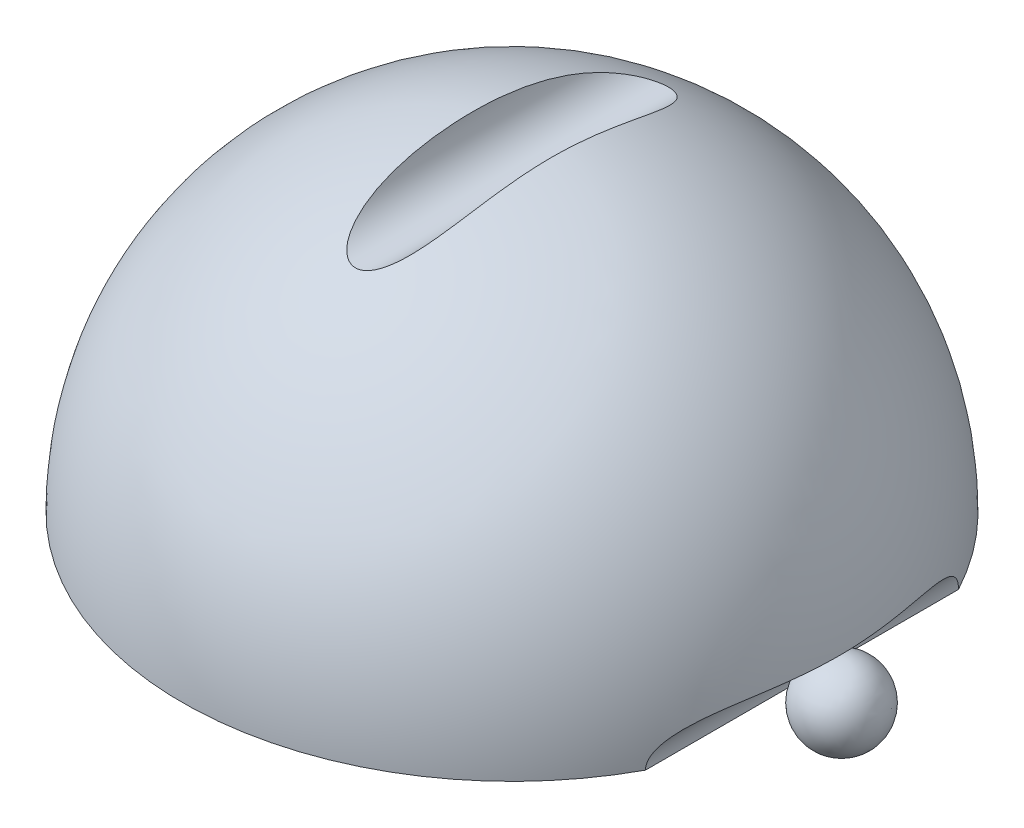
ISO-10303-21;
HEADER;
FILE_DESCRIPTION(('STEP AP214'),'2;1');
FILE_NAME('part.step','',(''),(''),'','','');
FILE_SCHEMA(('AUTOMOTIVE_DESIGN { 1 0 10303 214 1 1 1 1 }'));
ENDSEC;
DATA;
#1=APPLICATION_CONTEXT('core data for automotive mechanical design processes');
#2=APPLICATION_PROTOCOL_DEFINITION('international standard','automotive_design',2000,#1);
#3=PRODUCT_CONTEXT('',#1,'mechanical');
#4=PRODUCT('Part','Part','',(#3));
#5=PRODUCT_RELATED_PRODUCT_CATEGORY('part','',(#4));
#6=PRODUCT_DEFINITION_FORMATION('','',#4);
#7=PRODUCT_DEFINITION_CONTEXT('part definition',#1,'design');
#8=PRODUCT_DEFINITION('design','',#6,#7);
#9=PRODUCT_DEFINITION_SHAPE('','',#8);
#10=(LENGTH_UNIT() NAMED_UNIT(*) SI_UNIT(.MILLI.,.METRE.));
#11=(NAMED_UNIT(*) PLANE_ANGLE_UNIT() SI_UNIT($,.RADIAN.));
#12=(NAMED_UNIT(*) SI_UNIT($,.STERADIAN.) SOLID_ANGLE_UNIT());
#13=UNCERTAINTY_MEASURE_WITH_UNIT(LENGTH_MEASURE(1.E-05),#10,'distance_accuracy_value','');
#14=(GEOMETRIC_REPRESENTATION_CONTEXT(3) GLOBAL_UNCERTAINTY_ASSIGNED_CONTEXT((#13)) GLOBAL_UNIT_ASSIGNED_CONTEXT((#10,
#11,#12)) REPRESENTATION_CONTEXT('',''));
#15=CARTESIAN_POINT('',(0.,0.,0.));
#16=DIRECTION('',(0.,0.,1.));
#17=DIRECTION('',(1.,0.,0.));
#18=AXIS2_PLACEMENT_3D('',#15,#16,#17);
#19=CARTESIAN_POINT('',(-24.9999999999996,-9.57567358739198E-13,0.));
#20=DIRECTION('',(0.,-1.,0.));
#21=DIRECTION('',(-1.,0.,0.));
#22=AXIS2_PLACEMENT_3D('',#19,#20,#21);
#23=SPHERICAL_SURFACE('',#22,3.00000000000192);
#24=CARTESIAN_POINT('',(-24.9999999999996,-3.00000000000287,0.));
#25=VERTEX_POINT('',#24);
#26=VERTEX_LOOP('',#25);
#27=FACE_BOUND('',#26,.T.);
#28=ADVANCED_FACE('F35',(#27),#23,.T.);
#29=CLOSED_SHELL('',(#28));
#30=MANIFOLD_SOLID_BREP('B2',#29);
#31=CARTESIAN_POINT('',(25.0000000000018,1.30451205393456E-12,0.));
#32=DIRECTION('',(0.,-1.,0.));
#33=DIRECTION('',(1.,0.,0.));
#34=AXIS2_PLACEMENT_3D('',#31,#32,#33);
#35=SPHERICAL_SURFACE('',#34,2.99999999999814);
#36=CARTESIAN_POINT('',(25.0000000000018,-2.99999999999683,0.));
#37=VERTEX_POINT('',#36);
#38=VERTEX_LOOP('',#37);
#39=FACE_BOUND('',#38,.T.);
#40=ADVANCED_FACE('F56',(#39),#35,.T.);
#41=CLOSED_SHELL('',(#40));
#42=MANIFOLD_SOLID_BREP('B6',#41);
#43=CARTESIAN_POINT('',(0.,0.,0.));
#44=DIRECTION('',(-1.,0.,0.));
#45=DIRECTION('',(0.,0.,1.));
#46=AXIS2_PLACEMENT_3D('',#43,#44,#45);
#47=SPHERICAL_SURFACE('',#46,25.);
#48=CARTESIAN_POINT('',(2.99459513123227,24.82,0.));
#49=CARTESIAN_POINT('',(2.99459002994164,24.8200010341323,-0.25265576789776));
#50=CARTESIAN_POINT('',(2.99437086192478,24.8161692104748,-0.505299648903943));
#51=CARTESIAN_POINT('',(2.99339434279487,24.8008583969848,-1.01036497633447));
#52=CARTESIAN_POINT('',(2.99263698281963,24.7893792812277,-1.26278641902748));
#53=CARTESIAN_POINT('',(2.99032785634988,24.7588113206602,-1.7672201514097));
#54=CARTESIAN_POINT('',(2.98877590979744,24.7397207512673,-2.01923233536802));
#55=CARTESIAN_POINT('',(2.98444168236329,24.6940005216895,-2.52255945930374));
#56=CARTESIAN_POINT('',(2.98165941368078,24.6673709362583,-2.77387440616971));
#57=CARTESIAN_POINT('',(2.97426574899215,24.6067120858621,-3.2752327928719));
#58=CARTESIAN_POINT('',(2.96965687213885,24.5726930410938,-3.52527750552213));
#59=CARTESIAN_POINT('',(2.95783832247132,24.4973603379234,-4.02420341065936));
#60=CARTESIAN_POINT('',(2.95062867697141,24.4560467561338,-4.27308461533819));
#61=CARTESIAN_POINT('',(2.93266383051907,24.3662991047845,-4.76933839604232));
#62=CARTESIAN_POINT('',(2.92190995223106,24.3178676952415,-5.01671149984996));
#63=CARTESIAN_POINT('',(2.89571833273564,24.2140719730851,-5.50973296995949));
#64=CARTESIAN_POINT('',(2.8802810485714,24.1587083372817,-5.75538150216625));
#65=CARTESIAN_POINT('',(2.84594785871526,24.0495388640764,-6.21025509902261));
#66=CARTESIAN_POINT('',(2.82784244990383,23.9966067332689,-6.41974923038269));
#67=CARTESIAN_POINT('',(2.78612479927193,23.8859958724863,-6.83693736282152));
#68=CARTESIAN_POINT('',(2.7625125905751,23.8283171710633,-7.04463137472028));
#69=CARTESIAN_POINT('',(2.7084636847782,23.708266774201,-7.45852710599056));
#70=CARTESIAN_POINT('',(2.67800484001222,23.645880295033,-7.66472168874952));
#71=CARTESIAN_POINT('',(2.60880230047747,23.5169256230985,-8.07438273964613));
#72=CARTESIAN_POINT('',(2.57005994519108,23.4503581076528,-8.27784964321596));
#73=CARTESIAN_POINT('',(2.48186568927576,23.3126605039513,-8.68381728552576));
#74=CARTESIAN_POINT('',(2.43228807145941,23.2414844116995,-8.88627544900523));
#75=CARTESIAN_POINT('',(2.32013638721345,23.095939741907,-9.28671507456019));
#76=CARTESIAN_POINT('',(2.25755099304934,23.0215684269094,-9.48469246683507));
#77=CARTESIAN_POINT('',(2.15155616949589,22.9087248572189,-9.776152989819));
#78=CARTESIAN_POINT('',(2.11430630215466,22.8709856895439,-9.87217063456748));
#79=CARTESIAN_POINT('',(2.03519517543913,22.7952356491169,-10.0621682343574));
#80=CARTESIAN_POINT('',(1.99333488586397,22.7572248350728,-10.1561486129774));
#81=CARTESIAN_POINT('',(1.90443400087695,22.6812625083566,-10.3414430913202));
#82=CARTESIAN_POINT('',(1.85740229144209,22.6433110041803,-10.432761433801));
#83=CARTESIAN_POINT('',(1.75734952807148,22.5677883617683,-10.6121919617891));
#84=CARTESIAN_POINT('',(1.70433145247294,22.530217044432,-10.7003057130465));
#85=CARTESIAN_POINT('',(1.60684936800668,22.4661415256702,-10.8488170978261));
#86=CARTESIAN_POINT('',(1.5640205787303,22.439425011158,-10.9101950752735));
#87=CARTESIAN_POINT('',(1.47429288379772,22.3867319968592,-11.0302766425632));
#88=CARTESIAN_POINT('',(1.4273931892596,22.360755641806,-11.088979710671));
#89=CARTESIAN_POINT('',(1.3292020201085,22.3099683408991,-11.2028932872626));
#90=CARTESIAN_POINT('',(1.27792104272857,22.2851548184516,-11.2581116215395));
#91=CARTESIAN_POINT('',(1.1704590638845,22.237123496637,-11.3642704037));
#92=CARTESIAN_POINT('',(1.11428116924969,22.2139047019827,-11.4152135242786));
#93=CARTESIAN_POINT('',(0.985245236795403,22.1654070227314,-11.5209786343505));
#94=CARTESIAN_POINT('',(0.911257643350384,22.1405914573643,-11.5746607228432));
#95=CARTESIAN_POINT('',(0.755397767221112,22.0955331279816,-11.6715764233962));
#96=CARTESIAN_POINT('',(0.673534321792494,22.0752853220485,-11.7148215595398));
#97=CARTESIAN_POINT('',(0.517223665484646,22.0440412018442,-11.7812926431603));
#98=CARTESIAN_POINT('',(0.443906984017223,22.0320543922008,-11.8066785914922));
#99=CARTESIAN_POINT('',(0.293609102521776,22.0134456236593,-11.8460167825763));
#100=CARTESIAN_POINT('',(0.216631691015358,22.0068182408865,-11.8599805849921));
#101=CARTESIAN_POINT('',(0.0607497823567619,21.9995968897523,-11.8751934610167));
#102=CARTESIAN_POINT('',(-0.0181620628563454,21.9990313802331,-11.8763825609381));
#103=CARTESIAN_POINT('',(-0.174908827787441,22.004075788078,-11.8657589424403));
#104=CARTESIAN_POINT('',(-0.252743365495015,22.0096878419193,-11.8539417258564));
#105=CARTESIAN_POINT('',(-0.399853419286438,22.0259059371233,-11.8196854820418));
#106=CARTESIAN_POINT('',(-0.469352878042775,22.0361518440078,-11.7980118960228));
#107=CARTESIAN_POINT('',(-0.604196930140237,22.0606718233543,-11.7459392011354));
#108=CARTESIAN_POINT('',(-0.669540154166282,22.0749472150354,-11.7155372346137));
#109=CARTESIAN_POINT('',(-0.834974632404294,22.1166026942784,-11.626387162715));
#110=CARTESIAN_POINT('',(-0.931250875626898,22.1465961006278,-11.5618001008763));
#111=CARTESIAN_POINT('',(-1.11170990083086,22.2119225698479,-11.4196735910011));
#112=CARTESIAN_POINT('',(-1.19585389228563,22.2472720498845,-11.3420942399039));
#113=CARTESIAN_POINT('',(-1.34338079311362,22.3165150162378,-11.1883605676771));
#114=CARTESIAN_POINT('',(-1.40804402037016,22.3500364706024,-11.1132444224772));
#115=CARTESIAN_POINT('',(-1.53011851612809,22.4185965069782,-10.95792913641));
#116=CARTESIAN_POINT('',(-1.58752393107921,22.4536362833465,-10.8777259700697));
#117=CARTESIAN_POINT('',(-1.69604843310649,22.5245958477972,-10.7134015343531));
#118=CARTESIAN_POINT('',(-1.74715852534925,22.5605168090907,-10.6292748901804));
#119=CARTESIAN_POINT('',(-1.84383323241742,22.6327401983433,-10.458026958691));
#120=CARTESIAN_POINT('',(-1.88939566177854,22.6690427705567,-10.3709045084179));
#121=CARTESIAN_POINT('',(-1.97851373875633,22.7440965274891,-10.1884268153809));
#122=CARTESIAN_POINT('',(-2.02173400214331,22.7828498746078,-10.0929095543456));
#123=CARTESIAN_POINT('',(-2.10332538946264,22.8601000897282,-9.89971417480105));
#124=CARTESIAN_POINT('',(-2.14169538840082,22.8985968962723,-9.80203556112795));
#125=CARTESIAN_POINT('',(-2.25047593595629,23.0134131933087,-9.50621833016289));
#126=CARTESIAN_POINT('',(-2.31449283212729,23.0890022887714,-9.30543466009358));
#127=CARTESIAN_POINT('',(-2.4292218574503,23.2371481173469,-8.89854731961881));
#128=CARTESIAN_POINT('',(-2.47990208154202,23.309697235899,-8.69243216436181));
#129=CARTESIAN_POINT('',(-2.57041639806041,23.4508146461759,-8.27662237183783));
#130=CARTESIAN_POINT('',(-2.61025496408764,23.5193845706209,-8.06692924902301));
#131=CARTESIAN_POINT('',(-2.68836800579964,23.6655081007717,-7.60191120089406));
#132=CARTESIAN_POINT('',(-2.72468980689617,23.7420666474886,-7.34594970836234));
#133=CARTESIAN_POINT('',(-2.78748282205676,23.8881331700004,-6.83079245340452));
#134=CARTESIAN_POINT('',(-2.81395155710888,23.957639368243,-6.57159589397252));
#135=CARTESIAN_POINT('',(-2.85925111203536,24.0892166345291,-6.05038492536747));
#136=CARTESIAN_POINT('',(-2.87807389347247,24.1512798294565,-5.78836784633618));
#137=CARTESIAN_POINT('',(-2.90983676242787,24.2675528043403,-5.26227632591487));
#138=CARTESIAN_POINT('',(-2.92277733230067,24.3217632279931,-4.99820205502616));
#139=CARTESIAN_POINT('',(-2.94426380204146,24.4221204049117,-4.46814025626013));
#140=CARTESIAN_POINT('',(-2.95280627233096,24.4682608468598,-4.20215139879266));
#141=CARTESIAN_POINT('',(-2.9666995309558,24.5522234335917,-3.66878069081896));
#142=CARTESIAN_POINT('',(-2.9720502778239,24.5900454702976,-3.4013988222601));
#143=CARTESIAN_POINT('',(-2.98054158105894,24.657192831296,-2.86567145498996));
#144=CARTESIAN_POINT('',(-2.98368323650782,24.6865223765509,-2.59732650232993));
#145=CARTESIAN_POINT('',(-2.98851882996415,24.736587272255,-2.05982231728852));
#146=CARTESIAN_POINT('',(-2.99021275359942,24.7573225373843,-1.79066307685001));
#147=CARTESIAN_POINT('',(-2.99287653359297,24.7925107968858,-1.21237186735133));
#148=CARTESIAN_POINT('',(-2.99370412671109,24.8056001145451,-0.903155305855824));
#149=CARTESIAN_POINT('',(-2.99462170454889,24.820295971072,-0.284443722366843));
#150=CARTESIAN_POINT('',(-2.99471167366354,24.8219022670068,0.0250513053792851));
#151=CARTESIAN_POINT('',(-2.994207838372,24.8136212883858,0.644011079546411));
#152=CARTESIAN_POINT('',(-2.99361376095635,24.8037294247906,0.953475764544498));
#153=CARTESIAN_POINT('',(-2.99140236403629,24.7724994297951,1.57181917887251));
#154=CARTESIAN_POINT('',(-2.98978505688205,24.7511614365478,1.88069791522959));
#155=CARTESIAN_POINT('',(-2.98479564199666,24.6971271592169,2.49778818573567));
#156=CARTESIAN_POINT('',(-2.98142161118907,24.6644184407249,2.80599861625142));
#157=CARTESIAN_POINT('',(-2.97180128483374,24.587826819898,3.42099696298621));
#158=CARTESIAN_POINT('',(-2.96555487293683,24.5439434649536,3.72778482107378));
#159=CARTESIAN_POINT('',(-2.94869304208774,24.4452788162558,4.33929469545695));
#160=CARTESIAN_POINT('',(-2.93808034289299,24.3905043175436,4.64401787794493));
#161=CARTESIAN_POINT('',(-2.91057319061607,24.2703721459964,5.25104926046865));
#162=CARTESIAN_POINT('',(-2.89367948516479,24.2050157332535,5.55335774355418));
#163=CARTESIAN_POINT('',(-2.848845109032,24.056166404822,6.18899828154549));
#164=CARTESIAN_POINT('',(-2.81987271521125,23.9714590054171,6.52198029696701));
#165=CARTESIAN_POINT('',(-2.76520857793254,23.8355314634171,7.01789245913551));
#166=CARTESIAN_POINT('',(-2.7451098235699,23.7887250400291,7.18266506333616));
#167=CARTESIAN_POINT('',(-2.70050975416541,23.6923014758836,7.51078070043352));
#168=CARTESIAN_POINT('',(-2.67600881376706,23.6426845745547,7.67412385374257));
#169=CARTESIAN_POINT('',(-2.6219366645466,23.5409749370836,7.99859285760477));
#170=CARTESIAN_POINT('',(-2.59238244423941,23.4888909060667,8.15972424423146));
#171=CARTESIAN_POINT('',(-2.52725517950272,23.3823216927932,8.47994943412523));
#172=CARTESIAN_POINT('',(-2.49168305651865,23.3278368790812,8.63904354532891));
#173=CARTESIAN_POINT('',(-2.41347883633162,23.2168213422661,8.95453988467617));
#174=CARTESIAN_POINT('',(-2.37085579052783,23.1602933138571,9.11094528381894));
#175=CARTESIAN_POINT('',(-2.27718901726521,23.0455428172749,9.42055187444651));
#176=CARTESIAN_POINT('',(-2.22614841557378,22.9873209846622,9.57375423164016));
#177=CARTESIAN_POINT('',(-2.12785414273968,22.8843532493809,9.83845781834522));
#178=CARTESIAN_POINT('',(-2.08280586982975,22.8398500246164,9.95086983562853));
#179=CARTESIAN_POINT('',(-1.98603297363263,22.7505524343904,10.1727420198407));
#180=CARTESIAN_POINT('',(-1.93430626119234,22.7057579820087,10.2822012500686));
#181=CARTESIAN_POINT('',(-1.82326861131508,22.6165683305144,10.4968114536275));
#182=CARTESIAN_POINT('',(-1.76398731962461,22.5721722604952,10.6019772520515));
#183=CARTESIAN_POINT('',(-1.63634551453602,22.4843738221547,10.8070253362695));
#184=CARTESIAN_POINT('',(-1.56799312821392,22.4409706046438,10.9069122408726));
#185=CARTESIAN_POINT('',(-1.42752625534676,22.3602863296548,11.090232823532));
#186=CARTESIAN_POINT('',(-1.35639404669805,22.3228164033793,11.1743268525619));
#187=CARTESIAN_POINT('',(-1.20370987952042,22.2507789032637,11.3343485709589));
#188=CARTESIAN_POINT('',(-1.1221408954609,22.2162162282204,11.4102625348654));
#189=CARTESIAN_POINT('',(-0.946036757824495,22.1514979413619,11.5511961256808));
#190=CARTESIAN_POINT('',(-0.851323483050081,22.1214172404054,11.6160327691494));
#191=CARTESIAN_POINT('',(-0.649759274521512,22.0693873107182,11.7274790629307));
#192=CARTESIAN_POINT('',(-0.542965102646007,22.0474019636885,11.7741697265929));
#193=CARTESIAN_POINT('',(-0.360863550834269,22.020923225234,11.8302288956037));
#194=CARTESIAN_POINT('',(-0.288330748011299,22.0129730567949,11.847002345202));
#195=CARTESIAN_POINT('',(-0.141160755262969,22.0024185952012,11.8692544197125));
#196=CARTESIAN_POINT('',(-0.0665250546215774,21.9998106105858,11.8747408439954));
#197=CARTESIAN_POINT('',(0.0827386585992067,22.0002112953154,11.8738972097734));
#198=CARTESIAN_POINT('',(0.157366582360825,22.0032258121204,11.8675548492094));
#199=CARTESIAN_POINT('',(0.304379065381932,22.014567991263,11.8436370184306));
#200=CARTESIAN_POINT('',(0.376761994102815,22.0228994247078,11.8260535752846));
#201=CARTESIAN_POINT('',(0.535769511586397,22.0468711656217,11.7752804994605));
#202=CARTESIAN_POINT('',(0.621276023264655,22.0638392231649,11.7392421995041));
#203=CARTESIAN_POINT('',(0.784719483331142,22.1032218283595,11.6550711024586));
#204=CARTESIAN_POINT('',(0.862641353838978,22.1256469267629,11.6069148700953));
#205=CARTESIAN_POINT('',(1.05098302875241,22.187538714609,11.4729942245061));
#206=CARTESIAN_POINT('',(1.1560632913869,22.2296454638673,11.3810104121824));
#207=CARTESIAN_POINT('',(1.35001027323813,22.3187863732309,11.1834930530631));
#208=CARTESIAN_POINT('',(1.43883675674332,22.365832319381,11.0779269541258));
#209=CARTESIAN_POINT('',(1.59886187629425,22.4599612442484,10.8633736334983));
#210=CARTESIAN_POINT('',(1.67071599436795,22.5069268225201,10.7548152863947));
#211=CARTESIAN_POINT('',(1.80427053153194,22.6018086531962,10.5319517875994));
#212=CARTESIAN_POINT('',(1.86596140884511,22.6497257521854,10.4176413654972));
#213=CARTESIAN_POINT('',(1.98089410453119,22.7457435812206,10.1846174123938));
#214=CARTESIAN_POINT('',(2.03411714363022,22.7938444836634,10.0658947957986));
#215=CARTESIAN_POINT('',(2.13324445127993,22.8895483591666,9.82532728169974));
#216=CARTESIAN_POINT('',(2.17915134777115,22.9371515052529,9.70348352363932));
#217=CARTESIAN_POINT('',(2.28210709034715,23.0506357772596,9.40734466757585));
#218=CARTESIAN_POINT('',(2.3361154975524,23.1160934198319,9.23183315868161));
#219=CARTESIAN_POINT('',(2.43412383165693,23.2445636807427,8.87712291339312));
#220=CARTESIAN_POINT('',(2.47811936772935,23.3075752164115,8.69792259680563));
#221=CARTESIAN_POINT('',(2.55788810204424,23.4307336932757,8.33642825996648));
#222=CARTESIAN_POINT('',(2.59364854315798,23.4908760770747,8.15412990332589));
#223=CARTESIAN_POINT('',(2.65826412308468,23.6078460412854,7.78725611476894));
#224=CARTESIAN_POINT('',(2.68711854908982,23.6646732790652,7.60268044986481));
#225=CARTESIAN_POINT('',(2.73915036937966,23.7749350188891,7.23103690598324));
#226=CARTESIAN_POINT('',(2.76230809976837,23.8283573104139,7.04396268118859));
#227=CARTESIAN_POINT('',(2.80377674955902,23.9313972901681,6.66824137010707));
#228=CARTESIAN_POINT('',(2.8220875209222,23.9810148621585,6.47959423596092));
#229=CARTESIAN_POINT('',(2.87097648633,24.1238332958936,5.9119680196648));
#230=CARTESIAN_POINT('',(2.89555587541943,24.2111016366549,5.53096233053717));
#231=CARTESIAN_POINT('',(2.9359827841414,24.3770819227069,4.72492671283026));
#232=CARTESIAN_POINT('',(2.9506473916077,24.453942831442,4.29946211805735));
#233=CARTESIAN_POINT('',(2.97209389963954,24.5862990766309,3.44494290745359));
#234=CARTESIAN_POINT('',(2.97887407402367,24.6417897326023,3.01588752617397));
#235=CARTESIAN_POINT('',(2.98822152474282,24.7306992035723,2.15625970195378));
#236=CARTESIAN_POINT('',(2.99079654849338,24.7641585402087,1.72569151680358));
#237=CARTESIAN_POINT('',(2.99398764402575,24.8088073079199,0.863403934620612));
#238=CARTESIAN_POINT('',(2.9946038472363,24.819998233094,0.431684616769474));
#239=CARTESIAN_POINT('',(2.99459513123227,24.82,0.));
#240=B_SPLINE_CURVE_WITH_KNOTS('',3,(#48,#49,#50,#51,#52,#53,#54,#55,#56,#57,#58,#59,#60,#61,
#62,#63,#64,#65,#66,#67,#68,#69,#70,#71,#72,#73,#74,#75,#76,#77,#78,#79,#80,#81,#82,#83,#84,#85,
#86,#87,#88,#89,#90,#91,#92,#93,#94,#95,#96,#97,#98,#99,#100,#101,#102,#103,#104,#105,#106,#107,
#108,#109,#110,#111,#112,#113,#114,#115,#116,#117,#118,#119,#120,#121,#122,#123,#124,#125,#126,
#127,#128,#129,#130,#131,#132,#133,#134,#135,#136,#137,#138,#139,#140,#141,#142,#143,#144,#145,
#146,#147,#148,#149,#150,#151,#152,#153,#154,#155,#156,#157,#158,#159,#160,#161,#162,#163,#164,
#165,#166,#167,#168,#169,#170,#171,#172,#173,#174,#175,#176,#177,#178,#179,#180,#181,#182,#183,
#184,#185,#186,#187,#188,#189,#190,#191,#192,#193,#194,#195,#196,#197,#198,#199,#200,#201,#202,
#203,#204,#205,#206,#207,#208,#209,#210,#211,#212,#213,#214,#215,#216,#217,#218,#219,#220,#221,
#222,#223,#224,#225,#226,#227,#228,#229,#230,#231,#232,#233,#234,#235,#236,#237,#238,#239),
.UNSPECIFIED.,.T.,.F.,(4,2,2,2,2,2,2,2,2,2,2,2,2,2,2,2,2,2,2,2,2,2,2,2,2,2,2,2,2,2,2,2,2,2,2,2,
2,2,2,2,2,2,2,2,2,2,2,2,2,2,2,2,2,2,2,2,2,2,2,2,2,2,2,2,2,2,2,2,2,2,2,2,2,2,2,2,2,2,2,2,2,2,2,2,
2,2,2,2,2,2,2,2,2,2,2,4),(0.,0.757917608730139,1.51584769806361,2.27394961481547,
3.0320440148004,3.78909651270841,4.54614105997707,5.3029034067606,6.05959192652919,
6.70998272306388,7.36036960757059,8.01289145525861,8.66530786680686,9.32573904458343,
9.98674778245417,10.3157163549371,10.6446158607916,10.972958803224,11.3011391023313,
11.5394196339146,11.777746444312,12.0155174481127,12.2531386820089,12.5364842125941,
12.8195154376741,13.054080500893,13.2884078802515,13.5238348836281,13.7593433337589,
13.9790585862289,14.1988458552012,14.5560368421292,14.9143456901047,15.2277837169666,
15.5414729458929,15.8556053028115,16.1698610123894,16.5050320492801,16.8402806852945,
17.5112588929739,18.1838279691607,18.8561191004761,19.6646371376197,20.473358459036,
21.2829278282706,22.0924307990213,22.9025640567815,23.7127078396598,24.5224482686504,
25.332196736155,26.2604618429598,27.1887465879258,28.1174019485987,29.0460461008093,
29.9757089790949,30.9054095177816,31.8345318213099,32.763543566399,33.7974220949734,
34.314755260128,34.8320444190142,35.3476275307951,35.8631317691795,36.377979308818,
36.8926360941554,37.2795300404714,37.6665453097396,38.0520861003525,38.4372837759489,
38.7857040879859,39.1347002035427,39.4889971039716,39.8416935468456,40.0653558187902,
40.2888634874069,40.5126037359525,40.736502852443,41.0179183272617,41.2998822807133,
41.7350107085875,42.1712021260711,42.5857748612871,43.0007346277083,43.4166022022373,
43.8323200598211,44.416771020236,45.0014777813548,45.5870843184817,46.1727512732402,
46.7604123306523,47.3480913346934,48.522372994713,49.8195379698815,51.1169868869273,
52.4120427237403,53.7070116658304),.UNSPECIFIED.);
#241=CARTESIAN_POINT('',(2.99459513123227,24.82,0.));
#242=VERTEX_POINT('',#241);
#243=EDGE_CURVE('E105',#242,#242,#240,.T.);
#244=ORIENTED_EDGE('',*,*,#243,.F.);
#245=EDGE_LOOP('',(#244));
#246=FACE_BOUND('',#245,.T.);
#247=CARTESIAN_POINT('',(22.0000000066687,-0.000199999999999796,-11.8743420729982));
#248=CARTESIAN_POINT('',(21.9999923657176,0.0391557497445105,-11.8743570401165));
#249=CARTESIAN_POINT('',(22.0007697857396,0.0784903742819215,-11.8727214864345));
#250=CARTESIAN_POINT('',(22.0038452395262,0.15679459879276,-11.8662443185693));
#251=CARTESIAN_POINT('',(22.0061416842269,0.195764537108919,-11.8614060547631));
#252=CARTESIAN_POINT('',(22.0151686943678,0.310884463781832,-11.8423701673497));
#253=CARTESIAN_POINT('',(22.0240393642859,0.38615528963723,-11.8236467273423));
#254=CARTESIAN_POINT('',(22.0492019774314,0.548622255901881,-11.770333178163));
#255=CARTESIAN_POINT('',(22.0667041568058,0.634756813185926,-11.7331436609496));
#256=CARTESIAN_POINT('',(22.1072317513077,0.799459877223689,-11.6464715891049));
#257=CARTESIAN_POINT('',(22.1302813955464,0.877993013565866,-11.5969350729217));
#258=CARTESIAN_POINT('',(22.1938497437458,1.0678713622669,-11.4592507577495));
#259=CARTESIAN_POINT('',(22.2370315290444,1.1736955423429,-11.364795979233));
#260=CARTESIAN_POINT('',(22.3282615401091,1.36873649624975,-11.1623142081453));
#261=CARTESIAN_POINT('',(22.3763196213024,1.45791855955883,-11.0542596188215));
#262=CARTESIAN_POINT('',(22.4726488246184,1.61891324219169,-10.8341660391973));
#263=CARTESIAN_POINT('',(22.5208196645725,1.69131284588645,-10.7225050711304));
#264=CARTESIAN_POINT('',(22.6180427702097,1.82569462815197,-10.4933794628649));
#265=CARTESIAN_POINT('',(22.6670958235421,1.88766692804395,-10.3759094540447));
#266=CARTESIAN_POINT('',(22.765289656994,2.00294968101095,-10.1365611924432));
#267=CARTESIAN_POINT('',(22.8144304248864,2.05624328964518,-10.014674915438));
#268=CARTESIAN_POINT('',(22.9121206460935,2.15536379843126,-9.76776408801076));
#269=CARTESIAN_POINT('',(22.9606703057005,2.20119337685551,-9.64274068193207));
#270=CARTESIAN_POINT('',(23.0766272339692,2.30410370871982,-9.33811659818772));
#271=CARTESIAN_POINT('',(23.14355468625,2.3580304500498,-9.15727070112827));
#272=CARTESIAN_POINT('',(23.274737709845,2.45563454010425,-8.79184516776703));
#273=CARTESIAN_POINT('',(23.3389920967575,2.49930738442886,-8.6072639291079));
#274=CARTESIAN_POINT('',(23.464398951081,2.57826006574208,-8.23497153112127));
#275=CARTESIAN_POINT('',(23.5255465812165,2.61352711194107,-8.04725606111576));
#276=CARTESIAN_POINT('',(23.6442822904982,2.67704293154767,-7.66952200703196));
#277=CARTESIAN_POINT('',(23.701870002106,2.70529098119585,-7.47950318756221));
#278=CARTESIAN_POINT('',(23.8134805065948,2.75607487303947,-7.09667429261954));
#279=CARTESIAN_POINT('',(23.8674850159203,2.77858287092693,-6.90385523381282));
#280=CARTESIAN_POINT('',(23.9714218330543,2.81870900929681,-6.51662594629632));
#281=CARTESIAN_POINT('',(24.0213540544292,2.83632704600973,-6.32221568390984));
#282=CARTESIAN_POINT('',(24.1647201767168,2.8831359402801,-5.73723769428627));
#283=CARTESIAN_POINT('',(24.2518145272951,2.90631979244045,-5.34461179321539));
#284=CARTESIAN_POINT('',(24.3975977969497,2.93970811831979,-4.60835468233178));
#285=CARTESIAN_POINT('',(24.4585299113928,2.95123652175466,-4.26521634984251));
#286=CARTESIAN_POINT('',(24.5665317123938,2.96902488841231,-3.57658431499418));
#287=CARTESIAN_POINT('',(24.6135998212175,2.97528425216498,-3.2310903491362));
#288=CARTESIAN_POINT('',(24.6935520679974,2.98457828758713,-2.53820866704468));
#289=CARTESIAN_POINT('',(24.7264273106423,2.98761093866832,-2.1908199009501));
#290=CARTESIAN_POINT('',(24.7777214540349,2.99186492068783,-1.49498035844339));
#291=CARTESIAN_POINT('',(24.7961410013193,2.99308633263669,-1.14652963022777));
#292=CARTESIAN_POINT('',(24.8183767912276,2.99451781834605,-0.449785229777746));
#293=CARTESIAN_POINT('',(24.8222191318293,2.99472969967149,-0.10149239416574));
#294=CARTESIAN_POINT('',(24.8153457565692,2.9943136955881,0.594960917727124));
#295=CARTESIAN_POINT('',(24.8046295392207,2.99368578125153,0.943121389035313));
#296=CARTESIAN_POINT('',(24.7687217780057,2.99112590349225,1.63851923414381));
#297=CARTESIAN_POINT('',(24.7435373351137,2.98919457969895,1.98575697688911));
#298=CARTESIAN_POINT('',(24.6788776521666,2.98294034460587,2.678843897126));
#299=CARTESIAN_POINT('',(24.6394037344781,2.9786176545867,3.0246932001122));
#300=CARTESIAN_POINT('',(24.5433940741118,2.96547109926367,3.73701712408542));
#301=CARTESIAN_POINT('',(24.4859105488562,2.95637108938506,4.10335978219347));
#302=CARTESIAN_POINT('',(24.3554978622516,2.93070505511388,4.83303540925743));
#303=CARTESIAN_POINT('',(24.2825683999083,2.91413888522137,5.19636831941907));
#304=CARTESIAN_POINT('',(24.1221391526966,2.86989447198429,5.9180028471881));
#305=CARTESIAN_POINT('',(24.0346852676648,2.84225085839918,6.27631657590259));
#306=CARTESIAN_POINT('',(23.8931760183879,2.78880913745982,6.80976114625029));
#307=CARTESIAN_POINT('',(23.8442920226964,2.76900259617098,6.98688180814952));
#308=CARTESIAN_POINT('',(23.7432339299397,2.72462725750749,7.33957639834782));
#309=CARTESIAN_POINT('',(23.6910601643432,2.7000589394016,7.51515048045111));
#310=CARTESIAN_POINT('',(23.5981763400515,2.65270028642757,7.81712219433842));
#311=CARTESIAN_POINT('',(23.5581917114223,2.631232715191,7.94395121099025));
#312=CARTESIAN_POINT('',(23.476671761763,2.58489279878659,8.19648412030437));
#313=CARTESIAN_POINT('',(23.4351364926168,2.56002056746323,8.32218805043744));
#314=CARTESIAN_POINT('',(23.3505162614442,2.50633628979997,8.57262549401471));
#315=CARTESIAN_POINT('',(23.3074274148939,2.47751377824714,8.69735546703762));
#316=CARTESIAN_POINT('',(23.2199582174454,2.41543517447987,8.94524742391229));
#317=CARTESIAN_POINT('',(23.1755779314388,2.38217930473115,9.06840948610225));
#318=CARTESIAN_POINT('',(23.0774938940543,2.30403899375615,9.33521282343732));
#319=CARTESIAN_POINT('',(23.0235694680666,2.25814017266796,9.47847982218995));
#320=CARTESIAN_POINT('',(22.9145842962963,2.15789936127594,9.76170270201134));
#321=CARTESIAN_POINT('',(22.8595230648701,2.1035536949347,9.90165711075045));
#322=CARTESIAN_POINT('',(22.7491541617539,1.98500159499822,10.1764971295273));
#323=CARTESIAN_POINT('',(22.693848448446,1.92083683406355,10.3114012943797));
#324=CARTESIAN_POINT('',(22.5837751671257,1.78040096536686,10.5749013598203));
#325=CARTESIAN_POINT('',(22.5290070396361,1.70414427676851,10.7035045379806));
#326=CARTESIAN_POINT('',(22.4349215691998,1.55754348285435,10.9207429195044));
#327=CARTESIAN_POINT('',(22.3951513695146,1.49045163604719,11.0113592496577));
#328=CARTESIAN_POINT('',(22.3177791362999,1.3462535279672,11.1856439128174));
#329=CARTESIAN_POINT('',(22.2801801689899,1.26913358142491,11.2693024900362));
#330=CARTESIAN_POINT('',(22.2084139543244,1.10244960196098,11.4274062641777));
#331=CARTESIAN_POINT('',(22.1742916907028,1.01275130670347,11.5017330269701));
#332=CARTESIAN_POINT('',(22.1126320115273,0.820486196732084,11.6349830275044));
#333=CARTESIAN_POINT('',(22.0850744265627,0.717960314018977,11.693953499535));
#334=CARTESIAN_POINT('',(22.0479462520152,0.539040650287855,11.7730061532933));
#335=CARTESIAN_POINT('',(22.0354566478507,0.466081904247342,11.7994741967436));
#336=CARTESIAN_POINT('',(22.0157818691861,0.316373872314682,11.8410873076823));
#337=CARTESIAN_POINT('',(22.0085827256394,0.239635143718758,11.8562621952195));
#338=CARTESIAN_POINT('',(22.0029248760838,0.135190070409887,11.8681827477905));
#339=CARTESIAN_POINT('',(22.0018283069471,0.108177042536669,11.8704922741743));
#340=CARTESIAN_POINT('',(22.0003651394748,0.054046711990692,11.8735734142569));
#341=CARTESIAN_POINT('',(21.999998463167,0.0269294207661877,11.8743451922286));
#342=CARTESIAN_POINT('',(22.0000000066687,-0.000199999999891411,11.8743420729992));
#343=B_SPLINE_CURVE_WITH_KNOTS('',3,(#247,#248,#249,#250,#251,#252,#253,#254,#255,#256,#257,
#258,#259,#260,#261,#262,#263,#264,#265,#266,#267,#268,#269,#270,#271,#272,#273,#274,#275,#276,
#277,#278,#279,#280,#281,#282,#283,#284,#285,#286,#287,#288,#289,#290,#291,#292,#293,#294,#295,
#296,#297,#298,#299,#300,#301,#302,#303,#304,#305,#306,#307,#308,#309,#310,#311,#312,#313,#314,
#315,#316,#317,#318,#319,#320,#321,#322,#323,#324,#325,#326,#327,#328,#329,#330,#331,#332,#333,
#334,#335,#336,#337,#338,#339,#340,#341,#342),.UNSPECIFIED.,.F.,.F.,(4,2,2,2,2,2,2,2,2,2,2,2,2,
2,2,2,2,2,2,2,2,2,2,2,2,2,2,2,2,2,2,2,2,2,2,2,2,2,2,2,2,2,2,2,2,2,2,4),(0.,0.11798571839713,
0.235848205769323,0.468880897084488,0.753639858739566,1.03966585448593,1.48199399073618,
1.92523462549145,2.3491865286049,2.77353784339944,3.19870320895017,3.62371567727729,
4.22399669127132,4.82454090937079,5.42599320105555,6.02750748540216,6.63188640253142,
7.23627814415778,8.44408450371135,9.48986938322552,10.5357732278869,11.5823316395035,
12.6288432407223,13.6734803565905,14.7181534571175,15.7623142717895,16.806378483152,
17.9187925548049,19.0312283060335,20.1402132120041,20.6945588512645,21.2488487250574,
21.6529128211909,22.0569634095939,22.4621058934648,22.8672280549506,23.3464446962661,
23.8258704779635,24.3033152675098,24.7801949455129,25.1383836411933,25.4970663875518,
25.8599195573203,26.2216430826331,26.4565903713977,26.690915049126,26.7722743471206,
26.8536249532894),.UNSPECIFIED.);
#344=CARTESIAN_POINT('',(22.0000000000021,0.,-11.8743420870341));
#345=VERTEX_POINT('',#344);
#346=CARTESIAN_POINT('',(22.0000000000021,0.,11.8743420870341));
#347=VERTEX_POINT('',#346);
#348=EDGE_CURVE('E82',#345,#347,#343,.T.);
#349=ORIENTED_EDGE('',*,*,#348,.F.);
#350=CARTESIAN_POINT('',(0.,0.,0.));
#351=DIRECTION('',(0.,-1.,0.));
#352=DIRECTION('',(1.,0.,0.));
#353=AXIS2_PLACEMENT_3D('',#350,#351,#352);
#354=CIRCLE('',#353,25.);
#355=CARTESIAN_POINT('',(-21.9999999999854,0.,-11.874342087065));
#356=VERTEX_POINT('',#355);
#357=EDGE_CURVE('E100',#356,#345,#354,.T.);
#358=ORIENTED_EDGE('',*,*,#357,.F.);
#359=CARTESIAN_POINT('',(-22.000000006652,-0.0002,11.8743420730292));
#360=CARTESIAN_POINT('',(-21.9999923657011,0.0391557497448377,11.8743570401472));
#361=CARTESIAN_POINT('',(-22.0007697857233,0.0784903742825582,11.8727214864648));
#362=CARTESIAN_POINT('',(-22.0038452395102,0.156794598793977,11.8662443185989));
#363=CARTESIAN_POINT('',(-22.0061416842111,0.195764537110408,11.8614060547923));
#364=CARTESIAN_POINT('',(-22.0151686943527,0.310884463784061,11.8423701673778));
#365=CARTESIAN_POINT('',(-22.0240393642712,0.386155289639874,11.8236467273697));
#366=CARTESIAN_POINT('',(-22.0492019774177,0.548622255905709,11.7703331781885));
#367=CARTESIAN_POINT('',(-22.0667041567928,0.63475681319046,11.7331436609739));
#368=CARTESIAN_POINT('',(-22.1072317512959,0.799459877229432,11.6464715891268));
#369=CARTESIAN_POINT('',(-22.1302813955354,0.87799301357211,11.5969350729423));
#370=CARTESIAN_POINT('',(-22.1938497437366,1.06787136227482,11.4592507577665));
#371=CARTESIAN_POINT('',(-22.2370315290365,1.17369554235179,11.3647959792476));
#372=CARTESIAN_POINT('',(-22.3282615401038,1.3687364962602,11.1623142081547));
#373=CARTESIAN_POINT('',(-22.3763196212984,1.45791855956985,11.0542596188283));
#374=CARTESIAN_POINT('',(-22.472648824617,1.61891324220394,10.8341660391985));
#375=CARTESIAN_POINT('',(-22.5208196645725,1.6913128458993,10.7225050711285));
#376=CARTESIAN_POINT('',(-22.6180427702124,1.82569462816576,10.4933794628569));
#377=CARTESIAN_POINT('',(-22.6670958235461,1.88766692805808,10.3759094540336));
#378=CARTESIAN_POINT('',(-22.7652896570004,2.00294968102553,10.1365611924258));
#379=CARTESIAN_POINT('',(-22.8144304248941,2.0562432896599,10.0146749154175));
#380=CARTESIAN_POINT('',(-22.9121206461036,2.15536379844608,9.7677640879839));
#381=CARTESIAN_POINT('',(-22.9606703057117,2.2011933768703,9.64274068190204));
#382=CARTESIAN_POINT('',(-23.0766272339832,2.30410370873456,9.3381165981495));
#383=CARTESIAN_POINT('',(-23.1435546862657,2.35803045006443,9.15727070108501));
#384=CARTESIAN_POINT('',(-23.2747377098637,2.45563454011841,8.79184516771363));
#385=CARTESIAN_POINT('',(-23.3389920967776,2.49930738444266,8.60726392904942));
#386=CARTESIAN_POINT('',(-23.4643989511037,2.57826006575501,8.23497153105256));
#387=CARTESIAN_POINT('',(-23.5255465812404,2.6135271119535,8.04725606104193));
#388=CARTESIAN_POINT('',(-23.6442822905243,2.67704293155895,7.66952200694783));
#389=CARTESIAN_POINT('',(-23.701870002133,2.7052909812065,7.47950318747291));
#390=CARTESIAN_POINT('',(-23.8134805066235,2.75607487304878,7.09667429251987));
#391=CARTESIAN_POINT('',(-23.8674850159497,2.77858287093555,6.90385523370795));
#392=CARTESIAN_POINT('',(-23.9714218330848,2.81870900930399,6.51662594618103));
#393=CARTESIAN_POINT('',(-24.0213540544602,2.83632704601618,6.32221568378933));
#394=CARTESIAN_POINT('',(-24.1647201767488,2.88313594028436,5.73723769415007));
#395=CARTESIAN_POINT('',(-24.2518145273273,2.90631979244325,5.3446117930687));
#396=CARTESIAN_POINT('',(-24.3975977969797,2.93970811831971,4.60835468217312));
#397=CARTESIAN_POINT('',(-24.4585299114209,2.95123652175331,4.26521634968244));
#398=CARTESIAN_POINT('',(-24.5665317124179,2.96902488840883,3.5765843148314));
#399=CARTESIAN_POINT('',(-24.6135998212396,2.97528425216063,3.2310903489721));
#400=CARTESIAN_POINT('',(-24.6935520680153,2.98457828758138,2.53820866687805));
#401=CARTESIAN_POINT('',(-24.7264273106579,2.98761093866204,2.19081990078225));
#402=CARTESIAN_POINT('',(-24.7777214540461,2.99186492068072,1.4949803582732));
#403=CARTESIAN_POINT('',(-24.7961410013281,2.99308633262928,1.14652963005646));
#404=CARTESIAN_POINT('',(-24.8183767912317,2.99451781833819,0.449785229604272));
#405=CARTESIAN_POINT('',(-24.822219131831,2.99472969966348,0.101492393991232));
#406=CARTESIAN_POINT('',(-24.8153457565659,2.99431369557982,-0.594960917903599));
#407=CARTESIAN_POINT('',(-24.804629539215,2.99368578124313,-0.943121389212719));
#408=CARTESIAN_POINT('',(-24.7687217779949,2.99112590348355,-1.63851923432297));
#409=CARTESIAN_POINT('',(-24.7435373351003,2.98919457969006,-1.9857569770691));
#410=CARTESIAN_POINT('',(-24.678877652148,2.98294034459642,-2.67884389730752));
#411=CARTESIAN_POINT('',(-24.639403734457,2.97861765457687,-3.02469320029443));
#412=CARTESIAN_POINT('',(-24.5433940740861,2.96547109925288,-3.73701712426221));
#413=CARTESIAN_POINT('',(-24.4859105488288,2.95637108937374,-4.10335978236414));
#414=CARTESIAN_POINT('',(-24.3554978622216,2.93070505510134,-4.83303540941584));
#415=CARTESIAN_POINT('',(-24.2825683998772,2.91413888520813,-5.19636831957133));
#416=CARTESIAN_POINT('',(-24.1221391526639,2.86989447196953,-5.91800284732806));
#417=CARTESIAN_POINT('',(-24.0346852676316,2.84225085838361,-6.27631657603639));
#418=CARTESIAN_POINT('',(-23.8931760183543,2.788809137443,-6.80976114637486));
#419=CARTESIAN_POINT('',(-23.8442920226628,2.76900259615373,-6.98688180827101));
#420=CARTESIAN_POINT('',(-23.7432339299061,2.7246272574894,-7.33957639846315));
#421=CARTESIAN_POINT('',(-23.6910601643097,2.7000589393831,-7.51515048056337));
#422=CARTESIAN_POINT('',(-23.5981763400181,2.65270028640831,-7.81712219444572));
#423=CARTESIAN_POINT('',(-23.5581917113889,2.63123271517139,-7.94395121109568));
#424=CARTESIAN_POINT('',(-23.4766717617297,2.58489279876627,-8.19648412040603));
#425=CARTESIAN_POINT('',(-23.4351364925836,2.56002056744255,-8.32218805053722));
#426=CARTESIAN_POINT('',(-23.3505162614112,2.50633628977858,-8.57262549411071));
#427=CARTESIAN_POINT('',(-23.3074274148611,2.4775137782254,-8.69735546713173));
#428=CARTESIAN_POINT('',(-23.2199582174129,2.41543517445743,-8.9452474240026));
#429=CARTESIAN_POINT('',(-23.1755779314066,2.38217930470837,-9.06840948619066));
#430=CARTESIAN_POINT('',(-23.0774938940226,2.30403899373267,-9.3352128235214));
#431=CARTESIAN_POINT('',(-23.0235694680353,2.25814017264415,-9.4784798222716));
#432=CARTESIAN_POINT('',(-22.9145842962659,2.15789936125152,-9.76170270208814));
#433=CARTESIAN_POINT('',(-22.8595230648402,2.10355369491001,-9.90165711082481));
#434=CARTESIAN_POINT('',(-22.7491541617251,1.98500159497306,-10.1764971295968));
#435=CARTESIAN_POINT('',(-22.6938484484176,1.9208368340382,-10.3114012944467));
#436=CARTESIAN_POINT('',(-22.5837751670986,1.78040096534125,-10.5749013598824));
#437=CARTESIAN_POINT('',(-22.5290070396097,1.70414427674284,-10.7035045380402));
#438=CARTESIAN_POINT('',(-22.4349215691743,1.55754348282823,-10.9207429195604));
#439=CARTESIAN_POINT('',(-22.3951513694894,1.49045163602058,-11.0113592497126));
#440=CARTESIAN_POINT('',(-22.3177791362753,1.3462535279396,-11.1856439128698));
#441=CARTESIAN_POINT('',(-22.2801801689656,1.2691335813968,-11.2693024900873));
#442=CARTESIAN_POINT('',(-22.208413954301,1.10244960193188,-11.4274062642261));
#443=CARTESIAN_POINT('',(-22.1742916906799,1.01275130667387,-11.501733027017));
#444=CARTESIAN_POINT('',(-22.1126320115054,0.820486196701631,-11.6349830275481));
#445=CARTESIAN_POINT('',(-22.0850744265415,0.717960313988166,-11.693953499577));
#446=CARTESIAN_POINT('',(-22.047946251995,0.53904065025637,-11.7730061533326));
#447=CARTESIAN_POINT('',(-22.035456647831,0.466081904215413,-11.7994741967818));
#448=CARTESIAN_POINT('',(-22.0157818691672,0.316373872282041,-11.8410873077182));
#449=CARTESIAN_POINT('',(-22.0085827256211,0.239635143685849,-11.8562621952541));
#450=CARTESIAN_POINT('',(-22.0029248760664,0.135190070382275,-11.8681827478229));
#451=CARTESIAN_POINT('',(-22.0018283069301,0.108177042514543,-11.870492274206));
#452=CARTESIAN_POINT('',(-22.0003651394582,0.054046711979601,-11.8735734142877));
#453=CARTESIAN_POINT('',(-21.9999984631505,0.0269294207606445,-11.8743451922593));
#454=CARTESIAN_POINT('',(-22.000000006652,-0.000199999999890419,-11.8743420730301));
#455=B_SPLINE_CURVE_WITH_KNOTS('',3,(#359,#360,#361,#362,#363,#364,#365,#366,#367,#368,#369,
#370,#371,#372,#373,#374,#375,#376,#377,#378,#379,#380,#381,#382,#383,#384,#385,#386,#387,#388,
#389,#390,#391,#392,#393,#394,#395,#396,#397,#398,#399,#400,#401,#402,#403,#404,#405,#406,#407,
#408,#409,#410,#411,#412,#413,#414,#415,#416,#417,#418,#419,#420,#421,#422,#423,#424,#425,#426,
#427,#428,#429,#430,#431,#432,#433,#434,#435,#436,#437,#438,#439,#440,#441,#442,#443,#444,#445,
#446,#447,#448,#449,#450,#451,#452,#453,#454),.UNSPECIFIED.,.F.,.F.,(4,2,2,2,2,2,2,2,2,2,2,2,2,
2,2,2,2,2,2,2,2,2,2,2,2,2,2,2,2,2,2,2,2,2,2,2,2,2,2,2,2,2,2,2,2,2,2,4),(0.,0.117985718398108,
0.235848205771274,0.468880897088332,0.753639858747022,1.03966585449705,1.48199399075526,
1.92523462551849,2.34918652864144,2.77353784344551,3.19870320900578,3.62371567734244,
4.22399669135166,4.82454090946633,5.42599320116631,6.02750748552815,6.63188640267267,
7.2362781443143,8.44408450389837,9.48986938341558,10.53577322808,11.5823316396996,
12.6288432409214,13.6734803567926,14.7181534573226,15.7623142719977,16.8063784833632,
17.9187925549988,19.03122830621,20.1402132121633,20.694558851415,21.2488487251993,
21.6529128213276,22.0569634097255,22.4621058935912,22.8672280550718,23.3464446963807,
23.8258704780715,24.3033152676112,24.7801949456077,25.1383836412861,25.4970663876424,
25.8599195574089,26.2216430827196,26.4565903714842,26.6909150492124,26.7722743471905,
26.8536249533426),.UNSPECIFIED.);
#456=CARTESIAN_POINT('',(-21.9999999999854,0.,11.874342087065));
#457=VERTEX_POINT('',#456);
#458=EDGE_CURVE('E88',#457,#356,#455,.T.);
#459=ORIENTED_EDGE('',*,*,#458,.F.);
#460=EDGE_CURVE('E101',#347,#457,#354,.T.);
#461=ORIENTED_EDGE('',*,*,#460,.F.);
#462=EDGE_LOOP('',(#349,#358,#459,#461));
#463=FACE_BOUND('',#462,.T.);
#464=ADVANCED_FACE('F68',(#246,#463),#47,.T.);
#465=CARTESIAN_POINT('',(0.,0.,0.));
#466=DIRECTION('',(0.,-1.,0.));
#467=DIRECTION('',(1.,0.,0.));
#468=AXIS2_PLACEMENT_3D('',#465,#466,#467);
#469=PLANE('',#468);
#470=ORIENTED_EDGE('',*,*,#357,.T.);
#471=DIRECTION('',(0.,0.,-1.));
#472=VECTOR('',#471,1.);
#473=CARTESIAN_POINT('',(22.0000000000021,0.,15.));
#474=LINE('',#473,#472);
#475=EDGE_CURVE('E54',#345,#347,#474,.F.);
#476=ORIENTED_EDGE('',*,*,#475,.T.);
#477=ORIENTED_EDGE('',*,*,#460,.T.);
#478=DIRECTION('',(0.,0.,-1.));
#479=VECTOR('',#478,1.);
#480=CARTESIAN_POINT('',(-21.9999999999854,0.,15.));
#481=LINE('',#480,#479);
#482=EDGE_CURVE('E76',#457,#356,#481,.T.);
#483=ORIENTED_EDGE('',*,*,#482,.T.);
#484=EDGE_LOOP('',(#470,#476,#477,#483));
#485=FACE_BOUND('',#484,.T.);
#486=ADVANCED_FACE('F103',(#485),#469,.T.);
#487=CARTESIAN_POINT('',(0.,25.,15.));
#488=DIRECTION('',(0.,0.,-1.));
#489=DIRECTION('',(-1.,0.,0.));
#490=AXIS2_PLACEMENT_3D('',#487,#488,#489);
#491=CYLINDRICAL_SURFACE('',#490,3.);
#492=ORIENTED_EDGE('',*,*,#243,.T.);
#493=EDGE_LOOP('',(#492));
#494=FACE_BOUND('',#493,.T.);
#495=ADVANCED_FACE('F116',(#494),#491,.F.);
#496=CARTESIAN_POINT('',(-24.9999999999936,-6.39641543033984E-12,15.));
#497=DIRECTION('',(0.,0.,-1.));
#498=DIRECTION('',(-1.,0.,0.));
#499=AXIS2_PLACEMENT_3D('',#496,#497,#498);
#500=CYLINDRICAL_SURFACE('',#499,3.00000000000824);
#501=ORIENTED_EDGE('',*,*,#458,.T.);
#502=ORIENTED_EDGE('',*,*,#482,.F.);
#503=EDGE_LOOP('',(#501,#502));
#504=FACE_BOUND('',#503,.T.);
#505=ADVANCED_FACE('F119',(#504),#500,.F.);
#506=CARTESIAN_POINT('',(25.0000000000064,6.39335381334197E-12,15.));
#507=DIRECTION('',(0.,0.,-1.));
#508=DIRECTION('',(-1.,0.,0.));
#509=AXIS2_PLACEMENT_3D('',#506,#507,#508);
#510=CYLINDRICAL_SURFACE('',#509,3.00000000000433);
#511=ORIENTED_EDGE('',*,*,#348,.T.);
#512=ORIENTED_EDGE('',*,*,#475,.F.);
#513=EDGE_LOOP('',(#511,#512));
#514=FACE_BOUND('',#513,.T.);
#515=ADVANCED_FACE('F94',(#514),#510,.F.);
#516=CLOSED_SHELL('',(#464,#486,#495,#505,#515));
#517=MANIFOLD_SOLID_BREP('B31',#516);
#518=ADVANCED_BREP_SHAPE_REPRESENTATION('',(#18,#30,#42,#517),#14);
#519=SHAPE_DEFINITION_REPRESENTATION(#9,#518);
ENDSEC;
END-ISO-10303-21;
